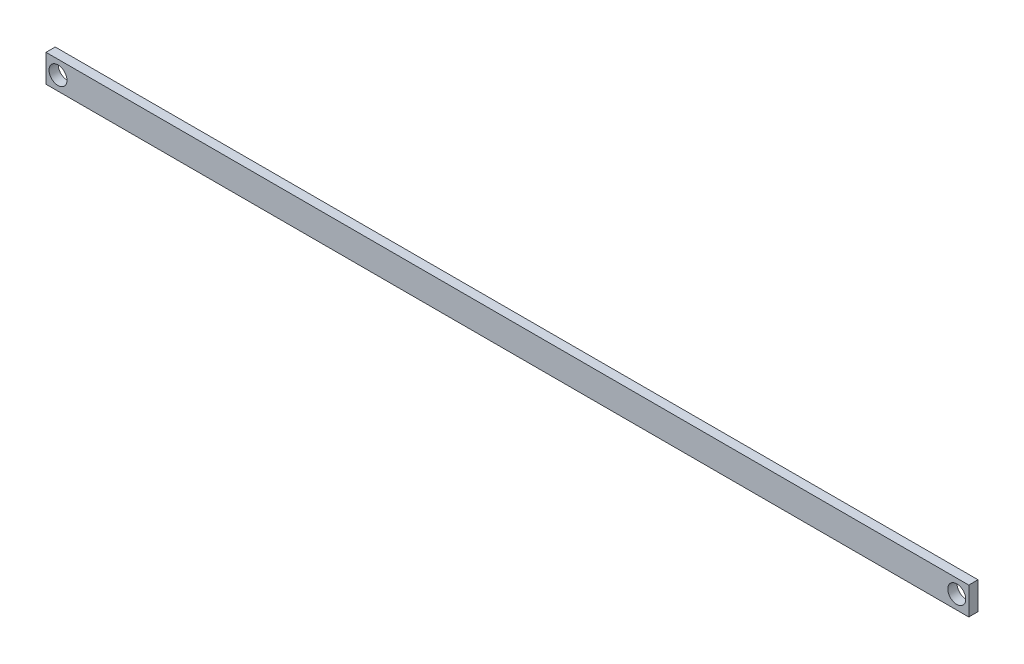
ISO-10303-21;
HEADER;
FILE_DESCRIPTION(('STEP AP214'),'2;1');
FILE_NAME('part.step','',(''),(''),'','','');
FILE_SCHEMA(('AUTOMOTIVE_DESIGN { 1 0 10303 214 1 1 1 1 }'));
ENDSEC;
DATA;
#1=APPLICATION_CONTEXT('core data for automotive mechanical design processes');
#2=APPLICATION_PROTOCOL_DEFINITION('international standard','automotive_design',2000,#1);
#3=PRODUCT_CONTEXT('',#1,'mechanical');
#4=PRODUCT('Part','Part','',(#3));
#5=PRODUCT_RELATED_PRODUCT_CATEGORY('part','',(#4));
#6=PRODUCT_DEFINITION_FORMATION('','',#4);
#7=PRODUCT_DEFINITION_CONTEXT('part definition',#1,'design');
#8=PRODUCT_DEFINITION('design','',#6,#7);
#9=PRODUCT_DEFINITION_SHAPE('','',#8);
#10=(LENGTH_UNIT() NAMED_UNIT(*) SI_UNIT(.MILLI.,.METRE.));
#11=(NAMED_UNIT(*) PLANE_ANGLE_UNIT() SI_UNIT($,.RADIAN.));
#12=(NAMED_UNIT(*) SI_UNIT($,.STERADIAN.) SOLID_ANGLE_UNIT());
#13=UNCERTAINTY_MEASURE_WITH_UNIT(LENGTH_MEASURE(1.E-05),#10,'distance_accuracy_value','');
#14=(GEOMETRIC_REPRESENTATION_CONTEXT(3) GLOBAL_UNCERTAINTY_ASSIGNED_CONTEXT((#13)) GLOBAL_UNIT_ASSIGNED_CONTEXT((#10,
#11,#12)) REPRESENTATION_CONTEXT('',''));
#15=CARTESIAN_POINT('',(0.,0.,0.));
#16=DIRECTION('',(0.,0.,1.));
#17=DIRECTION('',(1.,0.,0.));
#18=AXIS2_PLACEMENT_3D('',#15,#16,#17);
#19=CARTESIAN_POINT('',(0.,0.,-5.));
#20=DIRECTION('',(-1.,0.,0.));
#21=DIRECTION('',(0.,-1.,0.));
#22=AXIS2_PLACEMENT_3D('',#19,#20,#21);
#23=PLANE('',#22);
#24=DIRECTION('',(0.,-1.,0.));
#25=VECTOR('',#24,1.);
#26=CARTESIAN_POINT('',(0.,0.,0.));
#27=LINE('',#26,#25);
#28=CARTESIAN_POINT('',(0.,0.,0.));
#29=VERTEX_POINT('',#28);
#30=CARTESIAN_POINT('',(0.,-15.,0.));
#31=VERTEX_POINT('',#30);
#32=EDGE_CURVE('E117',#29,#31,#27,.T.);
#33=ORIENTED_EDGE('',*,*,#32,.F.);
#34=DIRECTION('',(0.,0.,1.));
#35=VECTOR('',#34,1.);
#36=CARTESIAN_POINT('',(0.,0.,-5.));
#37=LINE('',#36,#35);
#38=CARTESIAN_POINT('',(0.,0.,-5.));
#39=VERTEX_POINT('',#38);
#40=EDGE_CURVE('E11',#39,#29,#37,.T.);
#41=ORIENTED_EDGE('',*,*,#40,.F.);
#42=DIRECTION('',(0.,-1.,0.));
#43=VECTOR('',#42,1.);
#44=CARTESIAN_POINT('',(0.,0.,-5.));
#45=LINE('',#44,#43);
#46=CARTESIAN_POINT('',(0.,-15.,-5.));
#47=VERTEX_POINT('',#46);
#48=EDGE_CURVE('E110',#39,#47,#45,.T.);
#49=ORIENTED_EDGE('',*,*,#48,.T.);
#50=DIRECTION('',(0.,0.,1.));
#51=VECTOR('',#50,1.);
#52=CARTESIAN_POINT('',(0.,-15.,-5.));
#53=LINE('',#52,#51);
#54=EDGE_CURVE('E48',#47,#31,#53,.T.);
#55=ORIENTED_EDGE('',*,*,#54,.T.);
#56=EDGE_LOOP('',(#33,#41,#49,#55));
#57=FACE_BOUND('',#56,.T.);
#58=ADVANCED_FACE('F44',(#57),#23,.T.);
#59=CARTESIAN_POINT('',(0.,0.,-5.));
#60=DIRECTION('',(0.,1.,0.));
#61=DIRECTION('',(0.,0.,1.));
#62=AXIS2_PLACEMENT_3D('',#59,#60,#61);
#63=PLANE('',#62);
#64=DIRECTION('',(-1.,0.,0.));
#65=VECTOR('',#64,1.);
#66=CARTESIAN_POINT('',(0.,0.,0.));
#67=LINE('',#66,#65);
#68=CARTESIAN_POINT('',(500.,0.,0.));
#69=VERTEX_POINT('',#68);
#70=EDGE_CURVE('E109',#69,#29,#67,.T.);
#71=ORIENTED_EDGE('',*,*,#70,.F.);
#72=DIRECTION('',(0.,0.,1.));
#73=VECTOR('',#72,1.);
#74=CARTESIAN_POINT('',(500.,0.,-5.));
#75=LINE('',#74,#73);
#76=CARTESIAN_POINT('',(500.,0.,-5.));
#77=VERTEX_POINT('',#76);
#78=EDGE_CURVE('E54',#77,#69,#75,.T.);
#79=ORIENTED_EDGE('',*,*,#78,.F.);
#80=DIRECTION('',(-1.,0.,0.));
#81=VECTOR('',#80,1.);
#82=CARTESIAN_POINT('',(0.,0.,-5.));
#83=LINE('',#82,#81);
#84=EDGE_CURVE('E105',#77,#39,#83,.T.);
#85=ORIENTED_EDGE('',*,*,#84,.T.);
#86=ORIENTED_EDGE('',*,*,#40,.T.);
#87=EDGE_LOOP('',(#71,#79,#85,#86));
#88=FACE_BOUND('',#87,.T.);
#89=ADVANCED_FACE('F134',(#88),#63,.T.);
#90=CARTESIAN_POINT('',(500.,-15.,-5.));
#91=DIRECTION('',(1.,0.,0.));
#92=DIRECTION('',(0.,0.,-1.));
#93=AXIS2_PLACEMENT_3D('',#90,#91,#92);
#94=PLANE('',#93);
#95=DIRECTION('',(0.,1.,0.));
#96=VECTOR('',#95,1.);
#97=CARTESIAN_POINT('',(500.,-15.,0.));
#98=LINE('',#97,#96);
#99=CARTESIAN_POINT('',(500.,-15.,0.));
#100=VERTEX_POINT('',#99);
#101=EDGE_CURVE('E96',#100,#69,#98,.T.);
#102=ORIENTED_EDGE('',*,*,#101,.F.);
#103=DIRECTION('',(0.,0.,1.));
#104=VECTOR('',#103,1.);
#105=CARTESIAN_POINT('',(500.,-15.,-5.));
#106=LINE('',#105,#104);
#107=CARTESIAN_POINT('',(500.,-15.,-5.));
#108=VERTEX_POINT('',#107);
#109=EDGE_CURVE('E93',#108,#100,#106,.T.);
#110=ORIENTED_EDGE('',*,*,#109,.F.);
#111=DIRECTION('',(0.,1.,0.));
#112=VECTOR('',#111,1.);
#113=CARTESIAN_POINT('',(500.,-15.,-5.));
#114=LINE('',#113,#112);
#115=EDGE_CURVE('E94',#108,#77,#114,.T.);
#116=ORIENTED_EDGE('',*,*,#115,.T.);
#117=ORIENTED_EDGE('',*,*,#78,.T.);
#118=EDGE_LOOP('',(#102,#110,#116,#117));
#119=FACE_BOUND('',#118,.T.);
#120=ADVANCED_FACE('F91',(#119),#94,.T.);
#121=CARTESIAN_POINT('',(0.,-15.,-5.));
#122=DIRECTION('',(0.,-1.,0.));
#123=DIRECTION('',(0.,0.,-1.));
#124=AXIS2_PLACEMENT_3D('',#121,#122,#123);
#125=PLANE('',#124);
#126=DIRECTION('',(1.,0.,0.));
#127=VECTOR('',#126,1.);
#128=CARTESIAN_POINT('',(0.,-15.,0.));
#129=LINE('',#128,#127);
#130=EDGE_CURVE('E118',#31,#100,#129,.T.);
#131=ORIENTED_EDGE('',*,*,#130,.F.);
#132=ORIENTED_EDGE('',*,*,#54,.F.);
#133=DIRECTION('',(1.,0.,0.));
#134=VECTOR('',#133,1.);
#135=CARTESIAN_POINT('',(0.,-15.,-5.));
#136=LINE('',#135,#134);
#137=EDGE_CURVE('E101',#47,#108,#136,.T.);
#138=ORIENTED_EDGE('',*,*,#137,.T.);
#139=ORIENTED_EDGE('',*,*,#109,.T.);
#140=EDGE_LOOP('',(#131,#132,#138,#139));
#141=FACE_BOUND('',#140,.T.);
#142=ADVANCED_FACE('F104',(#141),#125,.T.);
#143=CARTESIAN_POINT('',(0.,0.,-5.));
#144=DIRECTION('',(0.,0.,1.));
#145=DIRECTION('',(1.,0.,0.));
#146=AXIS2_PLACEMENT_3D('',#143,#144,#145);
#147=PLANE('',#146);
#148=CARTESIAN_POINT('',(6.5,-7.5,-5.));
#149=DIRECTION('',(0.,0.,1.));
#150=DIRECTION('',(1.,0.,0.));
#151=AXIS2_PLACEMENT_3D('',#148,#149,#150);
#152=CIRCLE('',#151,4.85);
#153=CARTESIAN_POINT('',(11.35,-7.5,-5.));
#154=VERTEX_POINT('',#153);
#155=EDGE_CURVE('E124',#154,#154,#152,.T.);
#156=ORIENTED_EDGE('',*,*,#155,.T.);
#157=EDGE_LOOP('',(#156));
#158=FACE_BOUND('',#157,.T.);
#159=CARTESIAN_POINT('',(493.5,-7.5,-5.));
#160=DIRECTION('',(0.,0.,1.));
#161=DIRECTION('',(1.,0.,0.));
#162=AXIS2_PLACEMENT_3D('',#159,#160,#161);
#163=CIRCLE('',#162,4.85000000000003);
#164=CARTESIAN_POINT('',(498.35,-7.5,-5.));
#165=VERTEX_POINT('',#164);
#166=EDGE_CURVE('E179',#165,#165,#163,.T.);
#167=ORIENTED_EDGE('',*,*,#166,.T.);
#168=EDGE_LOOP('',(#167));
#169=FACE_BOUND('',#168,.T.);
#170=ORIENTED_EDGE('',*,*,#48,.F.);
#171=ORIENTED_EDGE('',*,*,#84,.F.);
#172=ORIENTED_EDGE('',*,*,#115,.F.);
#173=ORIENTED_EDGE('',*,*,#137,.F.);
#174=EDGE_LOOP('',(#170,#171,#172,#173));
#175=FACE_BOUND('',#174,.T.);
#176=ADVANCED_FACE('F99',(#158,#169,#175),#147,.F.);
#177=CARTESIAN_POINT('',(0.,0.,0.));
#178=DIRECTION('',(0.,0.,1.));
#179=DIRECTION('',(1.,0.,0.));
#180=AXIS2_PLACEMENT_3D('',#177,#178,#179);
#181=PLANE('',#180);
#182=CARTESIAN_POINT('',(6.5,-7.5,0.));
#183=DIRECTION('',(0.,0.,1.));
#184=DIRECTION('',(1.,0.,0.));
#185=AXIS2_PLACEMENT_3D('',#182,#183,#184);
#186=CIRCLE('',#185,4.85);
#187=CARTESIAN_POINT('',(11.35,-7.5,0.));
#188=VERTEX_POINT('',#187);
#189=EDGE_CURVE('E169',#188,#188,#186,.T.);
#190=ORIENTED_EDGE('',*,*,#189,.F.);
#191=EDGE_LOOP('',(#190));
#192=FACE_BOUND('',#191,.T.);
#193=CARTESIAN_POINT('',(493.5,-7.5,0.));
#194=DIRECTION('',(0.,0.,1.));
#195=DIRECTION('',(1.,0.,0.));
#196=AXIS2_PLACEMENT_3D('',#193,#194,#195);
#197=CIRCLE('',#196,4.85000000000003);
#198=CARTESIAN_POINT('',(498.35,-7.5,0.));
#199=VERTEX_POINT('',#198);
#200=EDGE_CURVE('E168',#199,#199,#197,.T.);
#201=ORIENTED_EDGE('',*,*,#200,.F.);
#202=EDGE_LOOP('',(#201));
#203=FACE_BOUND('',#202,.T.);
#204=ORIENTED_EDGE('',*,*,#32,.T.);
#205=ORIENTED_EDGE('',*,*,#130,.T.);
#206=ORIENTED_EDGE('',*,*,#101,.T.);
#207=ORIENTED_EDGE('',*,*,#70,.T.);
#208=EDGE_LOOP('',(#204,#205,#206,#207));
#209=FACE_BOUND('',#208,.T.);
#210=ADVANCED_FACE('F135',(#192,#203,#209),#181,.T.);
#211=CARTESIAN_POINT('',(493.5,-7.5,-5.));
#212=DIRECTION('',(0.,0.,1.));
#213=DIRECTION('',(1.,0.,0.));
#214=AXIS2_PLACEMENT_3D('',#211,#212,#213);
#215=CYLINDRICAL_SURFACE('',#214,4.85000000000003);
#216=ORIENTED_EDGE('',*,*,#166,.F.);
#217=EDGE_LOOP('',(#216));
#218=FACE_BOUND('',#217,.T.);
#219=ORIENTED_EDGE('',*,*,#200,.T.);
#220=EDGE_LOOP('',(#219));
#221=FACE_BOUND('',#220,.T.);
#222=ADVANCED_FACE('F151',(#218,#221),#215,.F.);
#223=CARTESIAN_POINT('',(6.5,-7.5,-5.));
#224=DIRECTION('',(0.,0.,1.));
#225=DIRECTION('',(1.,0.,0.));
#226=AXIS2_PLACEMENT_3D('',#223,#224,#225);
#227=CYLINDRICAL_SURFACE('',#226,4.85);
#228=ORIENTED_EDGE('',*,*,#155,.F.);
#229=EDGE_LOOP('',(#228));
#230=FACE_BOUND('',#229,.T.);
#231=ORIENTED_EDGE('',*,*,#189,.T.);
#232=EDGE_LOOP('',(#231));
#233=FACE_BOUND('',#232,.T.);
#234=ADVANCED_FACE('F158',(#230,#233),#227,.F.);
#235=CLOSED_SHELL('',(#58,#89,#120,#142,#176,#210,#222,#234));
#236=MANIFOLD_SOLID_BREP('B2',#235);
#237=ADVANCED_BREP_SHAPE_REPRESENTATION('',(#18,#236),#14);
#238=SHAPE_DEFINITION_REPRESENTATION(#9,#237);
ENDSEC;
END-ISO-10303-21;
